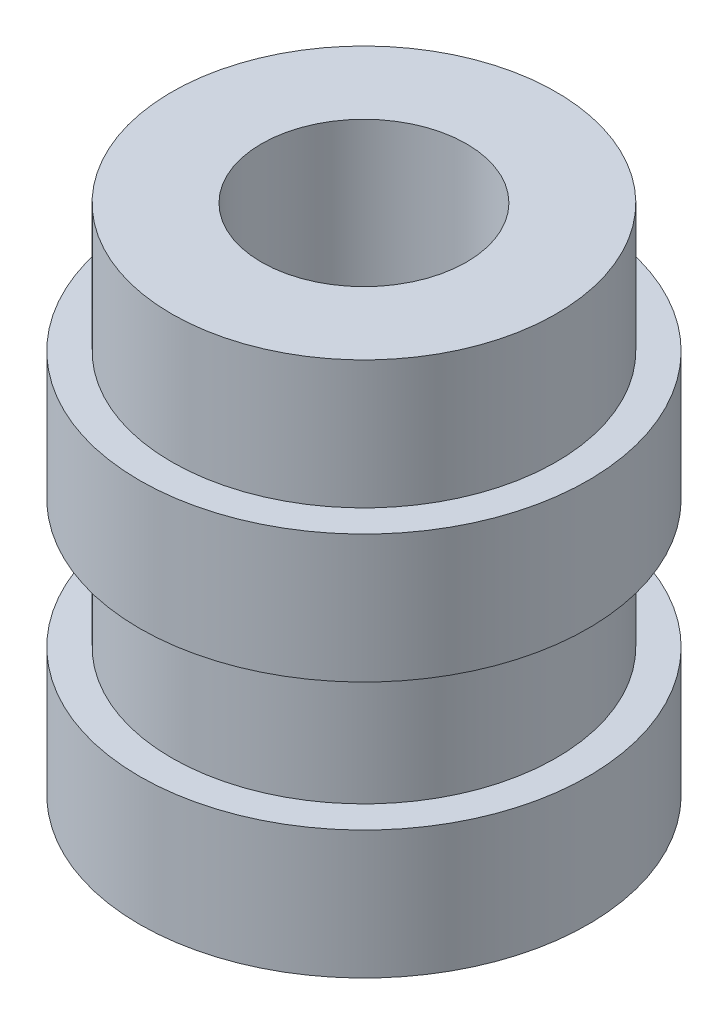
ISO-10303-21;
HEADER;
FILE_DESCRIPTION(('STEP AP214'),'2;1');
FILE_NAME('part.step','',(''),(''),'','','');
FILE_SCHEMA(('AUTOMOTIVE_DESIGN { 1 0 10303 214 1 1 1 1 }'));
ENDSEC;
DATA;
#1=APPLICATION_CONTEXT('core data for automotive mechanical design processes');
#2=APPLICATION_PROTOCOL_DEFINITION('international standard','automotive_design',2000,#1);
#3=PRODUCT_CONTEXT('',#1,'mechanical');
#4=PRODUCT('Part','Part','',(#3));
#5=PRODUCT_RELATED_PRODUCT_CATEGORY('part','',(#4));
#6=PRODUCT_DEFINITION_FORMATION('','',#4);
#7=PRODUCT_DEFINITION_CONTEXT('part definition',#1,'design');
#8=PRODUCT_DEFINITION('design','',#6,#7);
#9=PRODUCT_DEFINITION_SHAPE('','',#8);
#10=(LENGTH_UNIT() NAMED_UNIT(*) SI_UNIT(.MILLI.,.METRE.));
#11=(NAMED_UNIT(*) PLANE_ANGLE_UNIT() SI_UNIT($,.RADIAN.));
#12=(NAMED_UNIT(*) SI_UNIT($,.STERADIAN.) SOLID_ANGLE_UNIT());
#13=UNCERTAINTY_MEASURE_WITH_UNIT(LENGTH_MEASURE(1.E-05),#10,'distance_accuracy_value','');
#14=(GEOMETRIC_REPRESENTATION_CONTEXT(3) GLOBAL_UNCERTAINTY_ASSIGNED_CONTEXT((#13)) GLOBAL_UNIT_ASSIGNED_CONTEXT((#10,
#11,#12)) REPRESENTATION_CONTEXT('',''));
#15=CARTESIAN_POINT('',(0.,0.,0.));
#16=DIRECTION('',(0.,0.,1.));
#17=DIRECTION('',(1.,0.,0.));
#18=AXIS2_PLACEMENT_3D('',#15,#16,#17);
#19=CARTESIAN_POINT('',(0.,4.,0.));
#20=DIRECTION('',(0.,1.,0.));
#21=DIRECTION('',(0.,0.,1.));
#22=AXIS2_PLACEMENT_3D('',#19,#20,#21);
#23=PLANE('',#22);
#24=CARTESIAN_POINT('',(0.,4.,0.));
#25=DIRECTION('',(0.,1.,0.));
#26=DIRECTION('',(0.,0.,1.));
#27=AXIS2_PLACEMENT_3D('',#24,#25,#26);
#28=CIRCLE('',#27,0.8);
#29=CARTESIAN_POINT('',(0.,4.,0.8));
#30=VERTEX_POINT('',#29);
#31=EDGE_CURVE('E26',#30,#30,#28,.T.);
#32=ORIENTED_EDGE('',*,*,#31,.F.);
#33=EDGE_LOOP('',(#32));
#34=FACE_BOUND('',#33,.T.);
#35=CARTESIAN_POINT('',(0.,4.,0.));
#36=DIRECTION('',(0.,1.,0.));
#37=DIRECTION('',(0.,0.,1.));
#38=AXIS2_PLACEMENT_3D('',#35,#36,#37);
#39=CIRCLE('',#38,1.5);
#40=CARTESIAN_POINT('',(0.,4.,1.5));
#41=VERTEX_POINT('',#40);
#42=EDGE_CURVE('E36',#41,#41,#39,.T.);
#43=ORIENTED_EDGE('',*,*,#42,.T.);
#44=EDGE_LOOP('',(#43));
#45=FACE_BOUND('',#44,.T.);
#46=ADVANCED_FACE('F15',(#34,#45),#23,.T.);
#47=CARTESIAN_POINT('',(0.,0.,0.));
#48=DIRECTION('',(0.,1.,0.));
#49=DIRECTION('',(0.,0.,1.));
#50=AXIS2_PLACEMENT_3D('',#47,#48,#49);
#51=PLANE('',#50);
#52=CARTESIAN_POINT('',(0.,0.,0.));
#53=DIRECTION('',(0.,1.,0.));
#54=DIRECTION('',(0.,0.,1.));
#55=AXIS2_PLACEMENT_3D('',#52,#53,#54);
#56=CIRCLE('',#55,0.8);
#57=CARTESIAN_POINT('',(0.,0.,0.8));
#58=VERTEX_POINT('',#57);
#59=EDGE_CURVE('E22',#58,#58,#56,.T.);
#60=ORIENTED_EDGE('',*,*,#59,.T.);
#61=EDGE_LOOP('',(#60));
#62=FACE_BOUND('',#61,.T.);
#63=CARTESIAN_POINT('',(0.,0.,0.));
#64=DIRECTION('',(0.,1.,0.));
#65=DIRECTION('',(0.,0.,1.));
#66=AXIS2_PLACEMENT_3D('',#63,#64,#65);
#67=CIRCLE('',#66,1.75);
#68=CARTESIAN_POINT('',(0.,0.,1.75));
#69=VERTEX_POINT('',#68);
#70=EDGE_CURVE('E10',#69,#69,#67,.T.);
#71=ORIENTED_EDGE('',*,*,#70,.F.);
#72=EDGE_LOOP('',(#71));
#73=FACE_BOUND('',#72,.T.);
#74=ADVANCED_FACE('F92',(#62,#73),#51,.F.);
#75=CARTESIAN_POINT('',(0.,4.,0.));
#76=DIRECTION('',(0.,-1.,0.));
#77=DIRECTION('',(0.,0.,-1.));
#78=AXIS2_PLACEMENT_3D('',#75,#76,#77);
#79=CYLINDRICAL_SURFACE('',#78,1.75);
#80=CARTESIAN_POINT('',(0.,1.,0.));
#81=DIRECTION('',(0.,1.,0.));
#82=DIRECTION('',(0.,0.,1.));
#83=AXIS2_PLACEMENT_3D('',#80,#81,#82);
#84=CIRCLE('',#83,1.75);
#85=CARTESIAN_POINT('',(0.,1.,1.75));
#86=VERTEX_POINT('',#85);
#87=EDGE_CURVE('E43',#86,#86,#84,.T.);
#88=ORIENTED_EDGE('',*,*,#87,.F.);
#89=EDGE_LOOP('',(#88));
#90=FACE_BOUND('',#89,.T.);
#91=ORIENTED_EDGE('',*,*,#70,.T.);
#92=EDGE_LOOP('',(#91));
#93=FACE_BOUND('',#92,.T.);
#94=ADVANCED_FACE('F17',(#90,#93),#79,.T.);
#95=CARTESIAN_POINT('',(0.,4.,0.));
#96=DIRECTION('',(0.,1.,0.));
#97=DIRECTION('',(0.,0.,1.));
#98=AXIS2_PLACEMENT_3D('',#95,#96,#97);
#99=CYLINDRICAL_SURFACE('',#98,0.8);
#100=ORIENTED_EDGE('',*,*,#59,.F.);
#101=EDGE_LOOP('',(#100));
#102=FACE_BOUND('',#101,.T.);
#103=ORIENTED_EDGE('',*,*,#31,.T.);
#104=EDGE_LOOP('',(#103));
#105=FACE_BOUND('',#104,.T.);
#106=ADVANCED_FACE('F77',(#102,#105),#99,.F.);
#107=CARTESIAN_POINT('',(-1.75,2.,0.));
#108=DIRECTION('',(0.,1.,0.));
#109=DIRECTION('',(0.,0.,1.));
#110=AXIS2_PLACEMENT_3D('',#107,#108,#109);
#111=PLANE('',#110);
#112=CARTESIAN_POINT('',(0.,2.,0.));
#113=DIRECTION('',(0.,1.,0.));
#114=DIRECTION('',(0.,0.,1.));
#115=AXIS2_PLACEMENT_3D('',#112,#113,#114);
#116=CIRCLE('',#115,1.75);
#117=CARTESIAN_POINT('',(0.,2.,1.75));
#118=VERTEX_POINT('',#117);
#119=EDGE_CURVE('E33',#118,#118,#116,.T.);
#120=ORIENTED_EDGE('',*,*,#119,.F.);
#121=EDGE_LOOP('',(#120));
#122=FACE_BOUND('',#121,.T.);
#123=CARTESIAN_POINT('',(0.,2.,0.));
#124=DIRECTION('',(0.,1.,0.));
#125=DIRECTION('',(0.,0.,1.));
#126=AXIS2_PLACEMENT_3D('',#123,#124,#125);
#127=CIRCLE('',#126,1.5);
#128=CARTESIAN_POINT('',(0.,2.,1.5));
#129=VERTEX_POINT('',#128);
#130=EDGE_CURVE('E37',#129,#129,#127,.T.);
#131=ORIENTED_EDGE('',*,*,#130,.T.);
#132=EDGE_LOOP('',(#131));
#133=FACE_BOUND('',#132,.T.);
#134=ADVANCED_FACE('F73',(#122,#133),#111,.F.);
#135=CARTESIAN_POINT('',(0.,4.75293588301462,0.));
#136=DIRECTION('',(0.,1.,0.));
#137=DIRECTION('',(0.,0.,1.));
#138=AXIS2_PLACEMENT_3D('',#135,#136,#137);
#139=CYLINDRICAL_SURFACE('',#138,1.5);
#140=ORIENTED_EDGE('',*,*,#130,.F.);
#141=EDGE_LOOP('',(#140));
#142=FACE_BOUND('',#141,.T.);
#143=CARTESIAN_POINT('',(0.,1.,0.));
#144=DIRECTION('',(0.,1.,0.));
#145=DIRECTION('',(0.,0.,1.));
#146=AXIS2_PLACEMENT_3D('',#143,#144,#145);
#147=CIRCLE('',#146,1.5);
#148=CARTESIAN_POINT('',(0.,1.,1.5));
#149=VERTEX_POINT('',#148);
#150=EDGE_CURVE('E40',#149,#149,#147,.T.);
#151=ORIENTED_EDGE('',*,*,#150,.T.);
#152=EDGE_LOOP('',(#151));
#153=FACE_BOUND('',#152,.T.);
#154=ADVANCED_FACE('F76',(#142,#153),#139,.T.);
#155=CARTESIAN_POINT('',(-1.75,1.,0.));
#156=DIRECTION('',(0.,-1.,0.));
#157=DIRECTION('',(0.,0.,-1.));
#158=AXIS2_PLACEMENT_3D('',#155,#156,#157);
#159=PLANE('',#158);
#160=ORIENTED_EDGE('',*,*,#150,.F.);
#161=EDGE_LOOP('',(#160));
#162=FACE_BOUND('',#161,.T.);
#163=ORIENTED_EDGE('',*,*,#87,.T.);
#164=EDGE_LOOP('',(#163));
#165=FACE_BOUND('',#164,.T.);
#166=ADVANCED_FACE('F70',(#162,#165),#159,.F.);
#167=CARTESIAN_POINT('',(0.,3.,0.));
#168=DIRECTION('',(0.,1.,0.));
#169=DIRECTION('',(0.,0.,1.));
#170=AXIS2_PLACEMENT_3D('',#167,#168,#169);
#171=CIRCLE('',#170,1.75);
#172=CARTESIAN_POINT('',(0.,3.,1.75));
#173=VERTEX_POINT('',#172);
#174=EDGE_CURVE('E30',#173,#173,#171,.T.);
#175=ORIENTED_EDGE('',*,*,#174,.F.);
#176=EDGE_LOOP('',(#175));
#177=FACE_BOUND('',#176,.T.);
#178=ORIENTED_EDGE('',*,*,#119,.T.);
#179=EDGE_LOOP('',(#178));
#180=FACE_BOUND('',#179,.T.);
#181=ADVANCED_FACE('F64',(#177,#180),#79,.T.);
#182=CARTESIAN_POINT('',(-1.75,3.,0.));
#183=DIRECTION('',(0.,-1.,0.));
#184=DIRECTION('',(0.,0.,-1.));
#185=AXIS2_PLACEMENT_3D('',#182,#183,#184);
#186=PLANE('',#185);
#187=CARTESIAN_POINT('',(0.,3.,0.));
#188=DIRECTION('',(0.,1.,0.));
#189=DIRECTION('',(0.,0.,1.));
#190=AXIS2_PLACEMENT_3D('',#187,#188,#189);
#191=CIRCLE('',#190,1.5);
#192=CARTESIAN_POINT('',(0.,3.,1.5));
#193=VERTEX_POINT('',#192);
#194=EDGE_CURVE('E48',#193,#193,#191,.T.);
#195=ORIENTED_EDGE('',*,*,#194,.F.);
#196=EDGE_LOOP('',(#195));
#197=FACE_BOUND('',#196,.T.);
#198=ORIENTED_EDGE('',*,*,#174,.T.);
#199=EDGE_LOOP('',(#198));
#200=FACE_BOUND('',#199,.T.);
#201=ADVANCED_FACE('F58',(#197,#200),#186,.F.);
#202=CARTESIAN_POINT('',(0.,4.75293588301462,0.));
#203=DIRECTION('',(0.,1.,0.));
#204=DIRECTION('',(0.,0.,1.));
#205=AXIS2_PLACEMENT_3D('',#202,#203,#204);
#206=CYLINDRICAL_SURFACE('',#205,1.5);
#207=ORIENTED_EDGE('',*,*,#42,.F.);
#208=EDGE_LOOP('',(#207));
#209=FACE_BOUND('',#208,.T.);
#210=ORIENTED_EDGE('',*,*,#194,.T.);
#211=EDGE_LOOP('',(#210));
#212=FACE_BOUND('',#211,.T.);
#213=ADVANCED_FACE('F55',(#209,#212),#206,.T.);
#214=CLOSED_SHELL('',(#46,#74,#94,#106,#134,#154,#166,#181,#201,#213));
#215=MANIFOLD_SOLID_BREP('B1',#214);
#216=ADVANCED_BREP_SHAPE_REPRESENTATION('',(#18,#215),#14);
#217=SHAPE_DEFINITION_REPRESENTATION(#9,#216);
ENDSEC;
END-ISO-10303-21;
